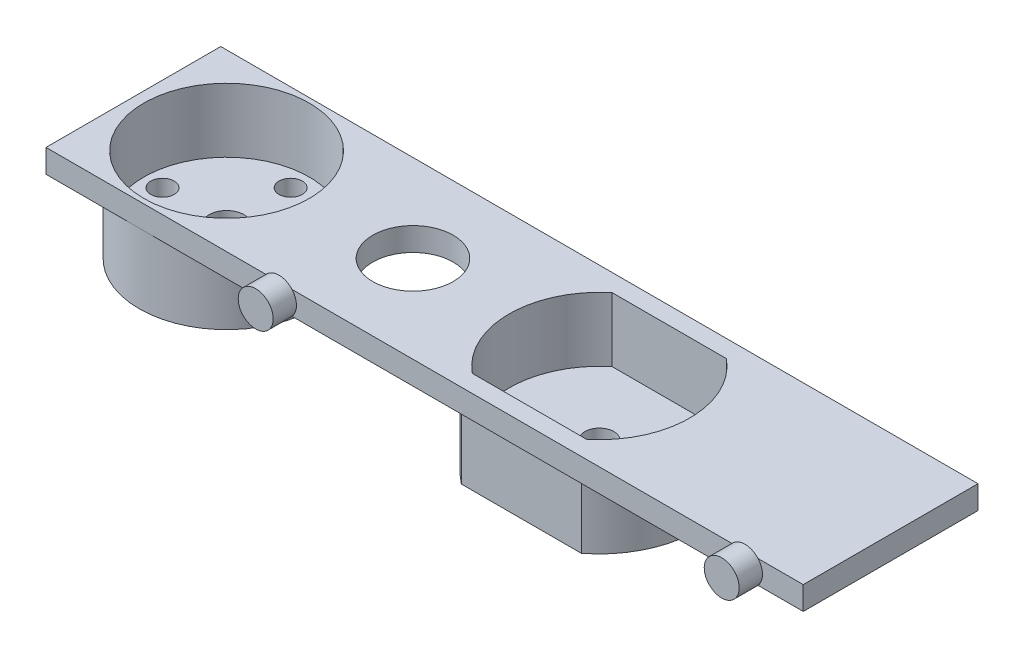
ISO-10303-21;
HEADER;
FILE_DESCRIPTION(('STEP AP214'),'2;1');
FILE_NAME('part.step','',(''),(''),'','','');
FILE_SCHEMA(('AUTOMOTIVE_DESIGN { 1 0 10303 214 1 1 1 1 }'));
ENDSEC;
DATA;
#1=APPLICATION_CONTEXT('core data for automotive mechanical design processes');
#2=APPLICATION_PROTOCOL_DEFINITION('international standard','automotive_design',2000,#1);
#3=PRODUCT_CONTEXT('',#1,'mechanical');
#4=PRODUCT('Part','Part','',(#3));
#5=PRODUCT_RELATED_PRODUCT_CATEGORY('part','',(#4));
#6=PRODUCT_DEFINITION_FORMATION('','',#4);
#7=PRODUCT_DEFINITION_CONTEXT('part definition',#1,'design');
#8=PRODUCT_DEFINITION('design','',#6,#7);
#9=PRODUCT_DEFINITION_SHAPE('','',#8);
#10=(LENGTH_UNIT() NAMED_UNIT(*) SI_UNIT(.MILLI.,.METRE.));
#11=(NAMED_UNIT(*) PLANE_ANGLE_UNIT() SI_UNIT($,.RADIAN.));
#12=(NAMED_UNIT(*) SI_UNIT($,.STERADIAN.) SOLID_ANGLE_UNIT());
#13=UNCERTAINTY_MEASURE_WITH_UNIT(LENGTH_MEASURE(1.E-05),#10,'distance_accuracy_value','');
#14=(GEOMETRIC_REPRESENTATION_CONTEXT(3) GLOBAL_UNCERTAINTY_ASSIGNED_CONTEXT((#13)) GLOBAL_UNIT_ASSIGNED_CONTEXT((#10,
#11,#12)) REPRESENTATION_CONTEXT('',''));
#15=CARTESIAN_POINT('',(0.,0.,0.));
#16=DIRECTION('',(0.,0.,1.));
#17=DIRECTION('',(1.,0.,0.));
#18=AXIS2_PLACEMENT_3D('',#15,#16,#17);
#19=CARTESIAN_POINT('',(0.,2.,0.));
#20=DIRECTION('',(0.,1.,0.));
#21=DIRECTION('',(0.,0.,1.));
#22=AXIS2_PLACEMENT_3D('',#19,#20,#21);
#23=PLANE('',#22);
#24=DIRECTION('',(0.,0.,-1.));
#25=VECTOR('',#24,1.);
#26=CARTESIAN_POINT('',(-40.,2.,0.));
#27=LINE('',#26,#25);
#28=CARTESIAN_POINT('',(-40.,2.,7.5));
#29=VERTEX_POINT('',#28);
#30=CARTESIAN_POINT('',(-40.,2.,-7.5));
#31=VERTEX_POINT('',#30);
#32=EDGE_CURVE('E415',#29,#31,#27,.T.);
#33=ORIENTED_EDGE('',*,*,#32,.F.);
#34=DIRECTION('',(-1.,0.,0.));
#35=VECTOR('',#34,1.);
#36=CARTESIAN_POINT('',(0.,2.,7.5));
#37=LINE('',#36,#35);
#38=CARTESIAN_POINT('',(-21.1180339887499,2.,7.5));
#39=VERTEX_POINT('',#38);
#40=EDGE_CURVE('E419',#39,#29,#37,.T.);
#41=ORIENTED_EDGE('',*,*,#40,.F.);
#42=CARTESIAN_POINT('',(-18.8819660112501,2.,7.5));
#43=VERTEX_POINT('',#42);
#44=EDGE_CURVE('E536',#43,#39,#37,.T.);
#45=ORIENTED_EDGE('',*,*,#44,.F.);
#46=CARTESIAN_POINT('',(18.8819660112501,2.,7.5));
#47=VERTEX_POINT('',#46);
#48=EDGE_CURVE('E533',#47,#43,#37,.T.);
#49=ORIENTED_EDGE('',*,*,#48,.F.);
#50=CARTESIAN_POINT('',(21.1180339887499,2.,7.5));
#51=VERTEX_POINT('',#50);
#52=EDGE_CURVE('E425',#51,#47,#37,.T.);
#53=ORIENTED_EDGE('',*,*,#52,.F.);
#54=CARTESIAN_POINT('',(25.,2.,7.5));
#55=VERTEX_POINT('',#54);
#56=EDGE_CURVE('E421',#55,#51,#37,.T.);
#57=ORIENTED_EDGE('',*,*,#56,.F.);
#58=DIRECTION('',(0.,0.,1.));
#59=VECTOR('',#58,1.);
#60=CARTESIAN_POINT('',(25.,2.,-7.5));
#61=LINE('',#60,#59);
#62=CARTESIAN_POINT('',(25.,2.,-7.5));
#63=VERTEX_POINT('',#62);
#64=EDGE_CURVE('E451',#63,#55,#61,.T.);
#65=ORIENTED_EDGE('',*,*,#64,.F.);
#66=DIRECTION('',(-1.,0.,0.));
#67=VECTOR('',#66,1.);
#68=CARTESIAN_POINT('',(0.,2.,-7.5));
#69=LINE('',#68,#67);
#70=EDGE_CURVE('E424',#63,#31,#69,.T.);
#71=ORIENTED_EDGE('',*,*,#70,.T.);
#72=EDGE_LOOP('',(#33,#41,#45,#49,#53,#57,#65,#71));
#73=FACE_BOUND('',#72,.T.);
#74=CARTESIAN_POINT('',(-16.,2.,0.));
#75=DIRECTION('',(0.,1.,0.));
#76=DIRECTION('',(0.,0.,1.));
#77=AXIS2_PLACEMENT_3D('',#74,#75,#76);
#78=CIRCLE('',#77,3.45);
#79=CARTESIAN_POINT('',(-16.,2.,3.45));
#80=VERTEX_POINT('',#79);
#81=EDGE_CURVE('E393',#80,#80,#78,.F.);
#82=ORIENTED_EDGE('',*,*,#81,.T.);
#83=EDGE_LOOP('',(#82));
#84=FACE_BOUND('',#83,.T.);
#85=CARTESIAN_POINT('',(-32.,2.,0.));
#86=DIRECTION('',(0.,1.,0.));
#87=DIRECTION('',(0.,0.,1.));
#88=AXIS2_PLACEMENT_3D('',#85,#86,#87);
#89=CIRCLE('',#88,7.1);
#90=CARTESIAN_POINT('',(-32.,2.,7.1));
#91=VERTEX_POINT('',#90);
#92=EDGE_CURVE('E253',#91,#91,#89,.T.);
#93=ORIENTED_EDGE('',*,*,#92,.F.);
#94=EDGE_LOOP('',(#93));
#95=FACE_BOUND('',#94,.T.);
#96=CARTESIAN_POINT('',(0.,2.,0.));
#97=DIRECTION('',(0.,1.,0.));
#98=DIRECTION('',(0.,0.,1.));
#99=AXIS2_PLACEMENT_3D('',#96,#97,#98);
#100=CIRCLE('',#99,7.75);
#101=CARTESIAN_POINT('',(4.90535421758714,2.,6.));
#102=VERTEX_POINT('',#101);
#103=CARTESIAN_POINT('',(4.90535421758714,2.,-6.));
#104=VERTEX_POINT('',#103);
#105=EDGE_CURVE('E280',#102,#104,#100,.T.);
#106=ORIENTED_EDGE('',*,*,#105,.F.);
#107=DIRECTION('',(-1.,0.,0.));
#108=VECTOR('',#107,1.);
#109=CARTESIAN_POINT('',(0.,2.,6.));
#110=LINE('',#109,#108);
#111=CARTESIAN_POINT('',(-4.90535421758714,2.,6.));
#112=VERTEX_POINT('',#111);
#113=EDGE_CURVE('E140',#102,#112,#110,.T.);
#114=ORIENTED_EDGE('',*,*,#113,.T.);
#115=CARTESIAN_POINT('',(0.,2.,0.));
#116=DIRECTION('',(0.,1.,0.));
#117=DIRECTION('',(0.,0.,1.));
#118=AXIS2_PLACEMENT_3D('',#115,#116,#117);
#119=CIRCLE('',#118,7.75);
#120=CARTESIAN_POINT('',(-4.90535421758714,2.,-6.));
#121=VERTEX_POINT('',#120);
#122=EDGE_CURVE('E266',#121,#112,#119,.T.);
#123=ORIENTED_EDGE('',*,*,#122,.F.);
#124=DIRECTION('',(-1.,0.,0.));
#125=VECTOR('',#124,1.);
#126=CARTESIAN_POINT('',(0.,2.,-6.));
#127=LINE('',#126,#125);
#128=EDGE_CURVE('E916',#104,#121,#127,.T.);
#129=ORIENTED_EDGE('',*,*,#128,.F.);
#130=EDGE_LOOP('',(#106,#114,#123,#129));
#131=FACE_BOUND('',#130,.T.);
#132=ADVANCED_FACE('F121',(#73,#84,#95,#131),#23,.T.);
#133=CARTESIAN_POINT('',(-32.,11.7580735803744,5.5));
#134=DIRECTION('',(0.,-1.,0.));
#135=DIRECTION('',(0.,0.,-1.));
#136=AXIS2_PLACEMENT_3D('',#133,#134,#135);
#137=CYLINDRICAL_SURFACE('',#136,0.999999999999998);
#138=CARTESIAN_POINT('',(-32.,-6.,5.5));
#139=DIRECTION('',(0.,1.,0.));
#140=DIRECTION('',(0.,0.,1.));
#141=AXIS2_PLACEMENT_3D('',#138,#139,#140);
#142=CIRCLE('',#141,0.999999999999998);
#143=CARTESIAN_POINT('',(-32.,-6.,6.5));
#144=VERTEX_POINT('',#143);
#145=EDGE_CURVE('E325',#144,#144,#142,.T.);
#146=ORIENTED_EDGE('',*,*,#145,.F.);
#147=EDGE_LOOP('',(#146));
#148=FACE_BOUND('',#147,.T.);
#149=CARTESIAN_POINT('',(-32.,-3.5,5.5));
#150=DIRECTION('',(0.,1.,0.));
#151=DIRECTION('',(0.,0.,1.));
#152=AXIS2_PLACEMENT_3D('',#149,#150,#151);
#153=CIRCLE('',#152,0.999999999999998);
#154=CARTESIAN_POINT('',(-32.,-3.5,6.5));
#155=VERTEX_POINT('',#154);
#156=EDGE_CURVE('E307',#155,#155,#153,.T.);
#157=ORIENTED_EDGE('',*,*,#156,.T.);
#158=EDGE_LOOP('',(#157));
#159=FACE_BOUND('',#158,.T.);
#160=ADVANCED_FACE('F561',(#148,#159),#137,.F.);
#161=CARTESIAN_POINT('',(-32.,11.7580735803744,0.));
#162=DIRECTION('',(0.,-1.,0.));
#163=DIRECTION('',(0.,0.,-1.));
#164=AXIS2_PLACEMENT_3D('',#161,#162,#163);
#165=CYLINDRICAL_SURFACE('',#164,1.5);
#166=CARTESIAN_POINT('',(-32.,-6.,0.));
#167=DIRECTION('',(0.,1.,0.));
#168=DIRECTION('',(0.,0.,1.));
#169=AXIS2_PLACEMENT_3D('',#166,#167,#168);
#170=CIRCLE('',#169,1.5);
#171=CARTESIAN_POINT('',(-32.,-6.,1.50000000000001));
#172=VERTEX_POINT('',#171);
#173=EDGE_CURVE('E329',#172,#172,#170,.T.);
#174=ORIENTED_EDGE('',*,*,#173,.F.);
#175=EDGE_LOOP('',(#174));
#176=FACE_BOUND('',#175,.T.);
#177=CARTESIAN_POINT('',(-32.,-3.5,0.));
#178=DIRECTION('',(0.,1.,0.));
#179=DIRECTION('',(0.,0.,1.));
#180=AXIS2_PLACEMENT_3D('',#177,#178,#179);
#181=CIRCLE('',#180,1.5);
#182=CARTESIAN_POINT('',(-32.,-3.5,1.50000000000001));
#183=VERTEX_POINT('',#182);
#184=EDGE_CURVE('E303',#183,#183,#181,.T.);
#185=ORIENTED_EDGE('',*,*,#184,.T.);
#186=EDGE_LOOP('',(#185));
#187=FACE_BOUND('',#186,.T.);
#188=ADVANCED_FACE('F567',(#176,#187),#165,.F.);
#189=CARTESIAN_POINT('',(-37.5,11.7580735803744,0.));
#190=DIRECTION('',(0.,-1.,0.));
#191=DIRECTION('',(0.,0.,-1.));
#192=AXIS2_PLACEMENT_3D('',#189,#190,#191);
#193=CYLINDRICAL_SURFACE('',#192,0.999999999999991);
#194=CARTESIAN_POINT('',(-37.5,-6.,0.));
#195=DIRECTION('',(0.,1.,0.));
#196=DIRECTION('',(0.,0.,1.));
#197=AXIS2_PLACEMENT_3D('',#194,#195,#196);
#198=CIRCLE('',#197,0.999999999999991);
#199=CARTESIAN_POINT('',(-37.5,-6.,0.999999999999992));
#200=VERTEX_POINT('',#199);
#201=EDGE_CURVE('E321',#200,#200,#198,.T.);
#202=ORIENTED_EDGE('',*,*,#201,.F.);
#203=EDGE_LOOP('',(#202));
#204=FACE_BOUND('',#203,.T.);
#205=CARTESIAN_POINT('',(-37.5,-3.5,0.));
#206=DIRECTION('',(0.,1.,0.));
#207=DIRECTION('',(0.,0.,1.));
#208=AXIS2_PLACEMENT_3D('',#205,#206,#207);
#209=CIRCLE('',#208,0.999999999999991);
#210=CARTESIAN_POINT('',(-37.5,-3.5,0.999999999999992));
#211=VERTEX_POINT('',#210);
#212=EDGE_CURVE('E299',#211,#211,#209,.T.);
#213=ORIENTED_EDGE('',*,*,#212,.T.);
#214=EDGE_LOOP('',(#213));
#215=FACE_BOUND('',#214,.T.);
#216=ADVANCED_FACE('F572',(#204,#215),#193,.F.);
#217=CARTESIAN_POINT('',(-26.5,11.7580735803744,0.));
#218=DIRECTION('',(0.,-1.,0.));
#219=DIRECTION('',(0.,0.,-1.));
#220=AXIS2_PLACEMENT_3D('',#217,#218,#219);
#221=CYLINDRICAL_SURFACE('',#220,0.999999999999998);
#222=CARTESIAN_POINT('',(-26.5,-6.,0.));
#223=DIRECTION('',(0.,1.,0.));
#224=DIRECTION('',(0.,0.,1.));
#225=AXIS2_PLACEMENT_3D('',#222,#223,#224);
#226=CIRCLE('',#225,0.999999999999998);
#227=CARTESIAN_POINT('',(-26.5,-6.,0.999999999999999));
#228=VERTEX_POINT('',#227);
#229=EDGE_CURVE('E317',#228,#228,#226,.T.);
#230=ORIENTED_EDGE('',*,*,#229,.F.);
#231=EDGE_LOOP('',(#230));
#232=FACE_BOUND('',#231,.T.);
#233=CARTESIAN_POINT('',(-26.5,-3.5,0.));
#234=DIRECTION('',(0.,1.,0.));
#235=DIRECTION('',(0.,0.,1.));
#236=AXIS2_PLACEMENT_3D('',#233,#234,#235);
#237=CIRCLE('',#236,0.999999999999998);
#238=CARTESIAN_POINT('',(-26.5,-3.5,0.999999999999999));
#239=VERTEX_POINT('',#238);
#240=EDGE_CURVE('E295',#239,#239,#237,.T.);
#241=ORIENTED_EDGE('',*,*,#240,.T.);
#242=EDGE_LOOP('',(#241));
#243=FACE_BOUND('',#242,.T.);
#244=ADVANCED_FACE('F787',(#232,#243),#221,.F.);
#245=CARTESIAN_POINT('',(-32.,11.7580735803744,-5.5));
#246=DIRECTION('',(0.,-1.,0.));
#247=DIRECTION('',(0.,0.,-1.));
#248=AXIS2_PLACEMENT_3D('',#245,#246,#247);
#249=CYLINDRICAL_SURFACE('',#248,0.999999999999991);
#250=CARTESIAN_POINT('',(-32.,-6.,-5.5));
#251=DIRECTION('',(0.,1.,0.));
#252=DIRECTION('',(0.,0.,1.));
#253=AXIS2_PLACEMENT_3D('',#250,#251,#252);
#254=CIRCLE('',#253,0.999999999999991);
#255=CARTESIAN_POINT('',(-32.,-6.,-4.50000000000001));
#256=VERTEX_POINT('',#255);
#257=EDGE_CURVE('E311',#256,#256,#254,.T.);
#258=ORIENTED_EDGE('',*,*,#257,.F.);
#259=EDGE_LOOP('',(#258));
#260=FACE_BOUND('',#259,.T.);
#261=CARTESIAN_POINT('',(-32.,-3.5,-5.5));
#262=DIRECTION('',(0.,1.,0.));
#263=DIRECTION('',(0.,0.,1.));
#264=AXIS2_PLACEMENT_3D('',#261,#262,#263);
#265=CIRCLE('',#264,0.999999999999991);
#266=CARTESIAN_POINT('',(-32.,-3.5,-4.50000000000001));
#267=VERTEX_POINT('',#266);
#268=EDGE_CURVE('E125',#267,#267,#265,.T.);
#269=ORIENTED_EDGE('',*,*,#268,.T.);
#270=EDGE_LOOP('',(#269));
#271=FACE_BOUND('',#270,.T.);
#272=ADVANCED_FACE('F774',(#260,#271),#249,.F.);
#273=CARTESIAN_POINT('',(0.,11.7580735803744,0.));
#274=DIRECTION('',(0.,-1.,0.));
#275=DIRECTION('',(0.,0.,-1.));
#276=AXIS2_PLACEMENT_3D('',#273,#274,#275);
#277=CYLINDRICAL_SURFACE('',#276,1.25);
#278=CARTESIAN_POINT('',(0.,-6.,0.));
#279=DIRECTION('',(0.,1.,0.));
#280=DIRECTION('',(0.,0.,1.));
#281=AXIS2_PLACEMENT_3D('',#278,#279,#280);
#282=CIRCLE('',#281,1.25);
#283=CARTESIAN_POINT('',(0.,-6.,1.25));
#284=VERTEX_POINT('',#283);
#285=EDGE_CURVE('E312',#284,#284,#282,.T.);
#286=ORIENTED_EDGE('',*,*,#285,.F.);
#287=EDGE_LOOP('',(#286));
#288=FACE_BOUND('',#287,.T.);
#289=CARTESIAN_POINT('',(0.,-3.5,0.));
#290=DIRECTION('',(0.,1.,0.));
#291=DIRECTION('',(0.,0.,1.));
#292=AXIS2_PLACEMENT_3D('',#289,#290,#291);
#293=CIRCLE('',#292,1.25);
#294=CARTESIAN_POINT('',(0.,-3.5,1.25));
#295=VERTEX_POINT('',#294);
#296=EDGE_CURVE('E262',#295,#295,#293,.T.);
#297=ORIENTED_EDGE('',*,*,#296,.T.);
#298=EDGE_LOOP('',(#297));
#299=FACE_BOUND('',#298,.T.);
#300=ADVANCED_FACE('F637',(#288,#299),#277,.F.);
#301=CARTESIAN_POINT('',(0.,0.,0.));
#302=DIRECTION('',(0.,1.,0.));
#303=DIRECTION('',(0.,0.,1.));
#304=AXIS2_PLACEMENT_3D('',#301,#302,#303);
#305=PLANE('',#304);
#306=CARTESIAN_POINT('',(-16.,0.,0.));
#307=DIRECTION('',(0.,-1.,0.));
#308=DIRECTION('',(0.,0.,-1.));
#309=AXIS2_PLACEMENT_3D('',#306,#307,#308);
#310=CIRCLE('',#309,3.45);
#311=CARTESIAN_POINT('',(-16.,0.,-3.45));
#312=VERTEX_POINT('',#311);
#313=EDGE_CURVE('E410',#312,#312,#310,.T.);
#314=ORIENTED_EDGE('',*,*,#313,.F.);
#315=EDGE_LOOP('',(#314));
#316=FACE_BOUND('',#315,.T.);
#317=DIRECTION('',(1.,0.,0.));
#318=VECTOR('',#317,1.);
#319=CARTESIAN_POINT('',(0.,0.,6.7));
#320=LINE('',#319,#318);
#321=CARTESIAN_POINT('',(-5.14902903468217,0.,6.7));
#322=VERTEX_POINT('',#321);
#323=CARTESIAN_POINT('',(5.14902903468217,0.,6.7));
#324=VERTEX_POINT('',#323);
#325=EDGE_CURVE('E381',#322,#324,#320,.T.);
#326=ORIENTED_EDGE('',*,*,#325,.T.);
#327=CARTESIAN_POINT('',(0.,0.,0.));
#328=DIRECTION('',(0.,1.,0.));
#329=DIRECTION('',(0.,0.,1.));
#330=AXIS2_PLACEMENT_3D('',#327,#328,#329);
#331=CIRCLE('',#330,8.45);
#332=CARTESIAN_POINT('',(5.14902903468217,0.,-6.7));
#333=VERTEX_POINT('',#332);
#334=EDGE_CURVE('E385',#324,#333,#331,.T.);
#335=ORIENTED_EDGE('',*,*,#334,.T.);
#336=DIRECTION('',(-1.,0.,0.));
#337=VECTOR('',#336,1.);
#338=CARTESIAN_POINT('',(0.,0.,-6.7));
#339=LINE('',#338,#337);
#340=CARTESIAN_POINT('',(-5.14902903468217,0.,-6.7));
#341=VERTEX_POINT('',#340);
#342=EDGE_CURVE('E373',#333,#341,#339,.T.);
#343=ORIENTED_EDGE('',*,*,#342,.T.);
#344=CARTESIAN_POINT('',(0.,0.,0.));
#345=DIRECTION('',(0.,1.,0.));
#346=DIRECTION('',(0.,0.,1.));
#347=AXIS2_PLACEMENT_3D('',#344,#345,#346);
#348=CIRCLE('',#347,8.45);
#349=EDGE_CURVE('E377',#341,#322,#348,.T.);
#350=ORIENTED_EDGE('',*,*,#349,.T.);
#351=EDGE_LOOP('',(#326,#335,#343,#350));
#352=FACE_BOUND('',#351,.T.);
#353=DIRECTION('',(-1.,0.,0.));
#354=VECTOR('',#353,1.);
#355=CARTESIAN_POINT('',(0.,0.,7.5));
#356=LINE('',#355,#354);
#357=CARTESIAN_POINT('',(-21.1180339887499,0.,7.5));
#358=VERTEX_POINT('',#357);
#359=CARTESIAN_POINT('',(-32.,0.,7.5));
#360=VERTEX_POINT('',#359);
#361=EDGE_CURVE('E510',#358,#360,#356,.T.);
#362=ORIENTED_EDGE('',*,*,#361,.T.);
#363=CARTESIAN_POINT('',(-32.,0.,0.));
#364=DIRECTION('',(0.,1.,0.));
#365=DIRECTION('',(0.,0.,1.));
#366=AXIS2_PLACEMENT_3D('',#363,#364,#365);
#367=CIRCLE('',#366,7.5);
#368=CARTESIAN_POINT('',(-32.,0.,-7.5));
#369=VERTEX_POINT('',#368);
#370=EDGE_CURVE('E372',#360,#369,#367,.T.);
#371=ORIENTED_EDGE('',*,*,#370,.T.);
#372=DIRECTION('',(-1.,0.,0.));
#373=VECTOR('',#372,1.);
#374=CARTESIAN_POINT('',(0.,0.,-7.5));
#375=LINE('',#374,#373);
#376=CARTESIAN_POINT('',(25.,0.,-7.5));
#377=VERTEX_POINT('',#376);
#378=EDGE_CURVE('E420',#377,#369,#375,.T.);
#379=ORIENTED_EDGE('',*,*,#378,.F.);
#380=DIRECTION('',(0.,0.,1.));
#381=VECTOR('',#380,1.);
#382=CARTESIAN_POINT('',(25.,0.,-7.5));
#383=LINE('',#382,#381);
#384=CARTESIAN_POINT('',(25.,0.,7.5));
#385=VERTEX_POINT('',#384);
#386=EDGE_CURVE('E414',#377,#385,#383,.T.);
#387=ORIENTED_EDGE('',*,*,#386,.T.);
#388=CARTESIAN_POINT('',(21.1180339887499,0.,7.5));
#389=VERTEX_POINT('',#388);
#390=EDGE_CURVE('E435',#385,#389,#356,.T.);
#391=ORIENTED_EDGE('',*,*,#390,.T.);
#392=CARTESIAN_POINT('',(18.8819660112501,0.,7.5));
#393=VERTEX_POINT('',#392);
#394=EDGE_CURVE('E440',#389,#393,#356,.T.);
#395=ORIENTED_EDGE('',*,*,#394,.T.);
#396=CARTESIAN_POINT('',(-18.8819660112501,0.,7.5));
#397=VERTEX_POINT('',#396);
#398=EDGE_CURVE('E509',#393,#397,#356,.T.);
#399=ORIENTED_EDGE('',*,*,#398,.T.);
#400=EDGE_CURVE('E506',#397,#358,#356,.T.);
#401=ORIENTED_EDGE('',*,*,#400,.T.);
#402=EDGE_LOOP('',(#362,#371,#379,#387,#391,#395,#399,#401));
#403=FACE_BOUND('',#402,.T.);
#404=ADVANCED_FACE('F471',(#316,#352,#403),#305,.F.);
#405=CARTESIAN_POINT('',(0.,2.,7.5));
#406=DIRECTION('',(0.,0.,1.));
#407=DIRECTION('',(1.,0.,0.));
#408=AXIS2_PLACEMENT_3D('',#405,#406,#407);
#409=PLANE('',#408);
#410=CARTESIAN_POINT('',(20.,0.999999999999999,7.5));
#411=DIRECTION('',(0.,0.,1.));
#412=DIRECTION('',(1.,0.,0.));
#413=AXIS2_PLACEMENT_3D('',#410,#411,#412);
#414=CIRCLE('',#413,1.5);
#415=EDGE_CURVE('E13',#47,#393,#414,.T.);
#416=ORIENTED_EDGE('',*,*,#415,.F.);
#417=ORIENTED_EDGE('',*,*,#48,.T.);
#418=CARTESIAN_POINT('',(-20.,0.999999999999995,7.5));
#419=DIRECTION('',(0.,0.,1.));
#420=DIRECTION('',(1.,0.,0.));
#421=AXIS2_PLACEMENT_3D('',#418,#419,#420);
#422=CIRCLE('',#421,1.5);
#423=EDGE_CURVE('E403',#397,#43,#422,.T.);
#424=ORIENTED_EDGE('',*,*,#423,.F.);
#425=ORIENTED_EDGE('',*,*,#398,.F.);
#426=EDGE_LOOP('',(#416,#417,#424,#425));
#427=FACE_BOUND('',#426,.T.);
#428=ADVANCED_FACE('F532',(#427),#409,.T.);
#429=ORIENTED_EDGE('',*,*,#40,.T.);
#430=DIRECTION('',(0.,-1.,0.));
#431=VECTOR('',#430,1.);
#432=CARTESIAN_POINT('',(-40.,2.,7.5));
#433=LINE('',#432,#431);
#434=CARTESIAN_POINT('',(-40.,0.,7.5));
#435=VERTEX_POINT('',#434);
#436=EDGE_CURVE('E447',#29,#435,#433,.T.);
#437=ORIENTED_EDGE('',*,*,#436,.T.);
#438=EDGE_CURVE('E433',#360,#435,#356,.T.);
#439=ORIENTED_EDGE('',*,*,#438,.F.);
#440=ORIENTED_EDGE('',*,*,#361,.F.);
#441=EDGE_CURVE('E491',#39,#358,#422,.T.);
#442=ORIENTED_EDGE('',*,*,#441,.F.);
#443=EDGE_LOOP('',(#429,#437,#439,#440,#442));
#444=FACE_BOUND('',#443,.T.);
#445=ADVANCED_FACE('F520',(#444),#409,.T.);
#446=CARTESIAN_POINT('',(-40.,0.,-7.5));
#447=VERTEX_POINT('',#446);
#448=EDGE_CURVE('E439',#369,#447,#375,.T.);
#449=ORIENTED_EDGE('',*,*,#448,.F.);
#450=EDGE_CURVE('E340',#369,#360,#367,.T.);
#451=ORIENTED_EDGE('',*,*,#450,.T.);
#452=ORIENTED_EDGE('',*,*,#438,.T.);
#453=DIRECTION('',(0.,0.,-1.));
#454=VECTOR('',#453,1.);
#455=CARTESIAN_POINT('',(-40.,0.,0.));
#456=LINE('',#455,#454);
#457=EDGE_CURVE('E429',#435,#447,#456,.T.);
#458=ORIENTED_EDGE('',*,*,#457,.T.);
#459=EDGE_LOOP('',(#449,#451,#452,#458));
#460=FACE_BOUND('',#459,.T.);
#461=ADVANCED_FACE('F516',(#460),#305,.F.);
#462=CARTESIAN_POINT('',(0.,2.,-7.5));
#463=DIRECTION('',(0.,0.,1.));
#464=DIRECTION('',(1.,0.,0.));
#465=AXIS2_PLACEMENT_3D('',#462,#463,#464);
#466=PLANE('',#465);
#467=ORIENTED_EDGE('',*,*,#378,.T.);
#468=ORIENTED_EDGE('',*,*,#448,.T.);
#469=DIRECTION('',(0.,-1.,0.));
#470=VECTOR('',#469,1.);
#471=CARTESIAN_POINT('',(-40.,2.,-7.5));
#472=LINE('',#471,#470);
#473=EDGE_CURVE('E428',#31,#447,#472,.T.);
#474=ORIENTED_EDGE('',*,*,#473,.F.);
#475=ORIENTED_EDGE('',*,*,#70,.F.);
#476=DIRECTION('',(0.,-1.,0.));
#477=VECTOR('',#476,1.);
#478=CARTESIAN_POINT('',(25.,2.,-7.5));
#479=LINE('',#478,#477);
#480=EDGE_CURVE('E455',#63,#377,#479,.T.);
#481=ORIENTED_EDGE('',*,*,#480,.T.);
#482=EDGE_LOOP('',(#467,#468,#474,#475,#481));
#483=FACE_BOUND('',#482,.T.);
#484=ADVANCED_FACE('F477',(#483),#466,.F.);
#485=EDGE_CURVE('E131',#389,#51,#414,.T.);
#486=ORIENTED_EDGE('',*,*,#485,.F.);
#487=ORIENTED_EDGE('',*,*,#390,.F.);
#488=DIRECTION('',(0.,-1.,0.));
#489=VECTOR('',#488,1.);
#490=CARTESIAN_POINT('',(25.,2.,7.5));
#491=LINE('',#490,#489);
#492=EDGE_CURVE('E434',#55,#385,#491,.T.);
#493=ORIENTED_EDGE('',*,*,#492,.F.);
#494=ORIENTED_EDGE('',*,*,#56,.T.);
#495=EDGE_LOOP('',(#486,#487,#493,#494));
#496=FACE_BOUND('',#495,.T.);
#497=ADVANCED_FACE('F486',(#496),#409,.T.);
#498=CARTESIAN_POINT('',(-40.,2.,0.));
#499=DIRECTION('',(-1.,0.,0.));
#500=DIRECTION('',(0.,0.,1.));
#501=AXIS2_PLACEMENT_3D('',#498,#499,#500);
#502=PLANE('',#501);
#503=ORIENTED_EDGE('',*,*,#457,.F.);
#504=ORIENTED_EDGE('',*,*,#436,.F.);
#505=ORIENTED_EDGE('',*,*,#32,.T.);
#506=ORIENTED_EDGE('',*,*,#473,.T.);
#507=EDGE_LOOP('',(#503,#504,#505,#506));
#508=FACE_BOUND('',#507,.T.);
#509=ADVANCED_FACE('F523',(#508),#502,.T.);
#510=CARTESIAN_POINT('',(25.,2.,-7.5));
#511=DIRECTION('',(1.,0.,0.));
#512=DIRECTION('',(0.,0.,-1.));
#513=AXIS2_PLACEMENT_3D('',#510,#511,#512);
#514=PLANE('',#513);
#515=ORIENTED_EDGE('',*,*,#386,.F.);
#516=ORIENTED_EDGE('',*,*,#480,.F.);
#517=ORIENTED_EDGE('',*,*,#64,.T.);
#518=ORIENTED_EDGE('',*,*,#492,.T.);
#519=EDGE_LOOP('',(#515,#516,#517,#518));
#520=FACE_BOUND('',#519,.T.);
#521=ADVANCED_FACE('F123',(#520),#514,.T.);
#522=CARTESIAN_POINT('',(-16.,11.7580735803744,0.));
#523=DIRECTION('',(0.,-1.,0.));
#524=DIRECTION('',(0.,0.,-1.));
#525=AXIS2_PLACEMENT_3D('',#522,#523,#524);
#526=CYLINDRICAL_SURFACE('',#525,3.45);
#527=ORIENTED_EDGE('',*,*,#313,.T.);
#528=EDGE_LOOP('',(#527));
#529=FACE_BOUND('',#528,.T.);
#530=ORIENTED_EDGE('',*,*,#81,.F.);
#531=EDGE_LOOP('',(#530));
#532=FACE_BOUND('',#531,.T.);
#533=ADVANCED_FACE('F546',(#529,#532),#526,.F.);
#534=CARTESIAN_POINT('',(-20.,0.999999999999995,7.5));
#535=DIRECTION('',(0.,0.,1.));
#536=DIRECTION('',(1.,0.,0.));
#537=AXIS2_PLACEMENT_3D('',#534,#535,#536);
#538=PLANE('',#537);
#539=EDGE_CURVE('E398',#43,#39,#422,.T.);
#540=ORIENTED_EDGE('',*,*,#539,.F.);
#541=ORIENTED_EDGE('',*,*,#44,.T.);
#542=EDGE_LOOP('',(#540,#541));
#543=FACE_BOUND('',#542,.T.);
#544=ADVANCED_FACE('F544',(#543),#538,.F.);
#545=CARTESIAN_POINT('',(-20.,0.999999999999995,9.5));
#546=DIRECTION('',(0.,0.,-1.));
#547=DIRECTION('',(-1.,0.,0.));
#548=AXIS2_PLACEMENT_3D('',#545,#546,#547);
#549=CYLINDRICAL_SURFACE('',#548,1.5);
#550=CARTESIAN_POINT('',(-20.,0.999999999999995,9.5));
#551=DIRECTION('',(0.,0.,1.));
#552=DIRECTION('',(1.,0.,0.));
#553=AXIS2_PLACEMENT_3D('',#550,#551,#552);
#554=CIRCLE('',#553,1.5);
#555=CARTESIAN_POINT('',(-18.5,0.999999999999995,9.5));
#556=VERTEX_POINT('',#555);
#557=EDGE_CURVE('E389',#556,#556,#554,.T.);
#558=ORIENTED_EDGE('',*,*,#557,.F.);
#559=EDGE_LOOP('',(#558));
#560=FACE_BOUND('',#559,.T.);
#561=ORIENTED_EDGE('',*,*,#539,.T.);
#562=ORIENTED_EDGE('',*,*,#441,.T.);
#563=EDGE_CURVE('E402',#358,#397,#422,.T.);
#564=ORIENTED_EDGE('',*,*,#563,.T.);
#565=ORIENTED_EDGE('',*,*,#423,.T.);
#566=EDGE_LOOP('',(#561,#562,#564,#565));
#567=FACE_BOUND('',#566,.T.);
#568=ADVANCED_FACE('F500',(#560,#567),#549,.T.);
#569=CARTESIAN_POINT('',(-20.,0.999999999999995,9.5));
#570=DIRECTION('',(0.,0.,1.));
#571=DIRECTION('',(1.,0.,0.));
#572=AXIS2_PLACEMENT_3D('',#569,#570,#571);
#573=PLANE('',#572);
#574=ORIENTED_EDGE('',*,*,#557,.T.);
#575=EDGE_LOOP('',(#574));
#576=FACE_BOUND('',#575,.T.);
#577=ADVANCED_FACE('F552',(#576),#573,.T.);
#578=ORIENTED_EDGE('',*,*,#400,.F.);
#579=ORIENTED_EDGE('',*,*,#563,.F.);
#580=EDGE_LOOP('',(#578,#579));
#581=FACE_BOUND('',#580,.T.);
#582=ADVANCED_FACE('F504',(#581),#538,.F.);
#583=CARTESIAN_POINT('',(20.,0.999999999999999,7.5));
#584=DIRECTION('',(0.,0.,1.));
#585=DIRECTION('',(1.,0.,0.));
#586=AXIS2_PLACEMENT_3D('',#583,#584,#585);
#587=PLANE('',#586);
#588=EDGE_CURVE('E394',#51,#47,#414,.T.);
#589=ORIENTED_EDGE('',*,*,#588,.F.);
#590=ORIENTED_EDGE('',*,*,#52,.T.);
#591=EDGE_LOOP('',(#589,#590));
#592=FACE_BOUND('',#591,.T.);
#593=ADVANCED_FACE('F539',(#592),#587,.F.);
#594=CARTESIAN_POINT('',(20.,0.999999999999999,9.5));
#595=DIRECTION('',(0.,0.,-1.));
#596=DIRECTION('',(-1.,0.,0.));
#597=AXIS2_PLACEMENT_3D('',#594,#595,#596);
#598=CYLINDRICAL_SURFACE('',#597,1.5);
#599=CARTESIAN_POINT('',(20.,0.999999999999999,9.5));
#600=DIRECTION('',(0.,0.,1.));
#601=DIRECTION('',(1.,0.,0.));
#602=AXIS2_PLACEMENT_3D('',#599,#600,#601);
#603=CIRCLE('',#602,1.5);
#604=CARTESIAN_POINT('',(21.5,0.999999999999999,9.5));
#605=VERTEX_POINT('',#604);
#606=EDGE_CURVE('E390',#605,#605,#603,.T.);
#607=ORIENTED_EDGE('',*,*,#606,.F.);
#608=EDGE_LOOP('',(#607));
#609=FACE_BOUND('',#608,.T.);
#610=ORIENTED_EDGE('',*,*,#588,.T.);
#611=ORIENTED_EDGE('',*,*,#415,.T.);
#612=EDGE_CURVE('E133',#393,#389,#414,.T.);
#613=ORIENTED_EDGE('',*,*,#612,.T.);
#614=ORIENTED_EDGE('',*,*,#485,.T.);
#615=EDGE_LOOP('',(#610,#611,#613,#614));
#616=FACE_BOUND('',#615,.T.);
#617=ADVANCED_FACE('F530',(#609,#616),#598,.T.);
#618=CARTESIAN_POINT('',(20.,0.999999999999999,9.5));
#619=DIRECTION('',(0.,0.,1.));
#620=DIRECTION('',(1.,0.,0.));
#621=AXIS2_PLACEMENT_3D('',#618,#619,#620);
#622=PLANE('',#621);
#623=ORIENTED_EDGE('',*,*,#606,.T.);
#624=EDGE_LOOP('',(#623));
#625=FACE_BOUND('',#624,.T.);
#626=ADVANCED_FACE('F647',(#625),#622,.T.);
#627=ORIENTED_EDGE('',*,*,#394,.F.);
#628=ORIENTED_EDGE('',*,*,#612,.F.);
#629=EDGE_LOOP('',(#627,#628));
#630=FACE_BOUND('',#629,.T.);
#631=ADVANCED_FACE('F528',(#630),#587,.F.);
#632=CARTESIAN_POINT('',(0.,-6.,0.));
#633=DIRECTION('',(0.,1.,0.));
#634=DIRECTION('',(0.,0.,1.));
#635=AXIS2_PLACEMENT_3D('',#632,#633,#634);
#636=CYLINDRICAL_SURFACE('',#635,8.45);
#637=ORIENTED_EDGE('',*,*,#334,.F.);
#638=DIRECTION('',(0.,1.,0.));
#639=VECTOR('',#638,1.);
#640=CARTESIAN_POINT('',(5.14902903468217,-6.,6.7));
#641=LINE('',#640,#639);
#642=CARTESIAN_POINT('',(5.14902903468217,-6.,6.7));
#643=VERTEX_POINT('',#642);
#644=EDGE_CURVE('E316',#643,#324,#641,.T.);
#645=ORIENTED_EDGE('',*,*,#644,.F.);
#646=CARTESIAN_POINT('',(0.,-6.,0.));
#647=DIRECTION('',(0.,1.,0.));
#648=DIRECTION('',(0.,0.,1.));
#649=AXIS2_PLACEMENT_3D('',#646,#647,#648);
#650=CIRCLE('',#649,8.45);
#651=CARTESIAN_POINT('',(5.14902903468217,-6.,-6.7));
#652=VERTEX_POINT('',#651);
#653=EDGE_CURVE('E341',#643,#652,#650,.T.);
#654=ORIENTED_EDGE('',*,*,#653,.T.);
#655=DIRECTION('',(0.,1.,0.));
#656=VECTOR('',#655,1.);
#657=CARTESIAN_POINT('',(5.14902903468217,-6.,-6.7));
#658=LINE('',#657,#656);
#659=EDGE_CURVE('E342',#652,#333,#658,.T.);
#660=ORIENTED_EDGE('',*,*,#659,.T.);
#661=EDGE_LOOP('',(#637,#645,#654,#660));
#662=FACE_BOUND('',#661,.T.);
#663=ADVANCED_FACE('F646',(#662),#636,.T.);
#664=CARTESIAN_POINT('',(5.14902903468217,-6.,6.7));
#665=DIRECTION('',(0.,0.,1.));
#666=DIRECTION('',(1.,0.,0.));
#667=AXIS2_PLACEMENT_3D('',#664,#665,#666);
#668=PLANE('',#667);
#669=ORIENTED_EDGE('',*,*,#325,.F.);
#670=DIRECTION('',(0.,1.,0.));
#671=VECTOR('',#670,1.);
#672=CARTESIAN_POINT('',(-5.14902903468217,-6.,6.7));
#673=LINE('',#672,#671);
#674=CARTESIAN_POINT('',(-5.14902903468217,-6.,6.7));
#675=VERTEX_POINT('',#674);
#676=EDGE_CURVE('E349',#675,#322,#673,.T.);
#677=ORIENTED_EDGE('',*,*,#676,.F.);
#678=DIRECTION('',(1.,0.,0.));
#679=VECTOR('',#678,1.);
#680=CARTESIAN_POINT('',(5.14902903468217,-6.,6.7));
#681=LINE('',#680,#679);
#682=EDGE_CURVE('E346',#675,#643,#681,.T.);
#683=ORIENTED_EDGE('',*,*,#682,.T.);
#684=ORIENTED_EDGE('',*,*,#644,.T.);
#685=EDGE_LOOP('',(#669,#677,#683,#684));
#686=FACE_BOUND('',#685,.T.);
#687=ADVANCED_FACE('F712',(#686),#668,.T.);
#688=CARTESIAN_POINT('',(0.,-6.,0.));
#689=DIRECTION('',(0.,1.,0.));
#690=DIRECTION('',(0.,0.,1.));
#691=AXIS2_PLACEMENT_3D('',#688,#689,#690);
#692=CYLINDRICAL_SURFACE('',#691,8.45);
#693=ORIENTED_EDGE('',*,*,#349,.F.);
#694=DIRECTION('',(0.,1.,0.));
#695=VECTOR('',#694,1.);
#696=CARTESIAN_POINT('',(-5.14902903468217,-6.,-6.7));
#697=LINE('',#696,#695);
#698=CARTESIAN_POINT('',(-5.14902903468217,-6.,-6.7));
#699=VERTEX_POINT('',#698);
#700=EDGE_CURVE('E148',#699,#341,#697,.T.);
#701=ORIENTED_EDGE('',*,*,#700,.F.);
#702=CARTESIAN_POINT('',(0.,-6.,0.));
#703=DIRECTION('',(0.,1.,0.));
#704=DIRECTION('',(0.,0.,1.));
#705=AXIS2_PLACEMENT_3D('',#702,#703,#704);
#706=CIRCLE('',#705,8.45);
#707=EDGE_CURVE('E359',#699,#675,#706,.T.);
#708=ORIENTED_EDGE('',*,*,#707,.T.);
#709=ORIENTED_EDGE('',*,*,#676,.T.);
#710=EDGE_LOOP('',(#693,#701,#708,#709));
#711=FACE_BOUND('',#710,.T.);
#712=ADVANCED_FACE('F721',(#711),#692,.T.);
#713=CARTESIAN_POINT('',(5.14902903468217,-6.,-6.7));
#714=DIRECTION('',(0.,0.,-1.));
#715=DIRECTION('',(-1.,0.,0.));
#716=AXIS2_PLACEMENT_3D('',#713,#714,#715);
#717=PLANE('',#716);
#718=ORIENTED_EDGE('',*,*,#342,.F.);
#719=ORIENTED_EDGE('',*,*,#659,.F.);
#720=DIRECTION('',(-1.,0.,0.));
#721=VECTOR('',#720,1.);
#722=CARTESIAN_POINT('',(5.14902903468217,-6.,-6.7));
#723=LINE('',#722,#721);
#724=EDGE_CURVE('E363',#652,#699,#723,.T.);
#725=ORIENTED_EDGE('',*,*,#724,.T.);
#726=ORIENTED_EDGE('',*,*,#700,.T.);
#727=EDGE_LOOP('',(#718,#719,#725,#726));
#728=FACE_BOUND('',#727,.T.);
#729=ADVANCED_FACE('F730',(#728),#717,.T.);
#730=CARTESIAN_POINT('',(0.,-6.,0.));
#731=DIRECTION('',(0.,1.,0.));
#732=DIRECTION('',(0.,0.,1.));
#733=AXIS2_PLACEMENT_3D('',#730,#731,#732);
#734=PLANE('',#733);
#735=ORIENTED_EDGE('',*,*,#653,.F.);
#736=ORIENTED_EDGE('',*,*,#682,.F.);
#737=ORIENTED_EDGE('',*,*,#707,.F.);
#738=ORIENTED_EDGE('',*,*,#724,.F.);
#739=EDGE_LOOP('',(#735,#736,#737,#738));
#740=FACE_BOUND('',#739,.T.);
#741=ORIENTED_EDGE('',*,*,#285,.T.);
#742=EDGE_LOOP('',(#741));
#743=FACE_BOUND('',#742,.T.);
#744=ADVANCED_FACE('F739',(#740,#743),#734,.F.);
#745=CARTESIAN_POINT('',(-32.,-6.,0.));
#746=DIRECTION('',(0.,1.,0.));
#747=DIRECTION('',(0.,0.,1.));
#748=AXIS2_PLACEMENT_3D('',#745,#746,#747);
#749=CYLINDRICAL_SURFACE('',#748,7.5);
#750=CARTESIAN_POINT('',(-32.,-6.,0.));
#751=DIRECTION('',(0.,1.,0.));
#752=DIRECTION('',(0.,0.,1.));
#753=AXIS2_PLACEMENT_3D('',#750,#751,#752);
#754=CIRCLE('',#753,7.5);
#755=CARTESIAN_POINT('',(-32.,-6.,7.5));
#756=VERTEX_POINT('',#755);
#757=EDGE_CURVE('E336',#756,#756,#754,.T.);
#758=ORIENTED_EDGE('',*,*,#757,.T.);
#759=EDGE_LOOP('',(#758));
#760=FACE_BOUND('',#759,.T.);
#761=ORIENTED_EDGE('',*,*,#370,.F.);
#762=ORIENTED_EDGE('',*,*,#450,.F.);
#763=EDGE_LOOP('',(#761,#762));
#764=FACE_BOUND('',#763,.T.);
#765=ADVANCED_FACE('F747',(#760,#764),#749,.T.);
#766=CARTESIAN_POINT('',(-32.,-6.,0.));
#767=DIRECTION('',(0.,1.,0.));
#768=DIRECTION('',(0.,0.,1.));
#769=AXIS2_PLACEMENT_3D('',#766,#767,#768);
#770=PLANE('',#769);
#771=ORIENTED_EDGE('',*,*,#757,.F.);
#772=EDGE_LOOP('',(#771));
#773=FACE_BOUND('',#772,.T.);
#774=ORIENTED_EDGE('',*,*,#257,.T.);
#775=EDGE_LOOP('',(#774));
#776=FACE_BOUND('',#775,.T.);
#777=ORIENTED_EDGE('',*,*,#201,.T.);
#778=EDGE_LOOP('',(#777));
#779=FACE_BOUND('',#778,.T.);
#780=ORIENTED_EDGE('',*,*,#145,.T.);
#781=EDGE_LOOP('',(#780));
#782=FACE_BOUND('',#781,.T.);
#783=ORIENTED_EDGE('',*,*,#173,.T.);
#784=EDGE_LOOP('',(#783));
#785=FACE_BOUND('',#784,.T.);
#786=ORIENTED_EDGE('',*,*,#229,.T.);
#787=EDGE_LOOP('',(#786));
#788=FACE_BOUND('',#787,.T.);
#789=ADVANCED_FACE('F757',(#773,#776,#779,#782,#785,#788),#770,.F.);
#790=CARTESIAN_POINT('',(0.,-26.0818325856979,6.));
#791=DIRECTION('',(0.,0.,-1.));
#792=DIRECTION('',(-1.,0.,0.));
#793=AXIS2_PLACEMENT_3D('',#790,#791,#792);
#794=PLANE('',#793);
#795=DIRECTION('',(0.,1.,0.));
#796=VECTOR('',#795,1.);
#797=CARTESIAN_POINT('',(-4.90535421758714,-26.0818325856979,6.));
#798=LINE('',#797,#796);
#799=CARTESIAN_POINT('',(-4.90535421758714,-3.5,6.));
#800=VERTEX_POINT('',#799);
#801=EDGE_CURVE('E247',#800,#112,#798,.T.);
#802=ORIENTED_EDGE('',*,*,#801,.T.);
#803=ORIENTED_EDGE('',*,*,#113,.F.);
#804=DIRECTION('',(0.,1.,0.));
#805=VECTOR('',#804,1.);
#806=CARTESIAN_POINT('',(4.90535421758714,-26.0818325856979,6.));
#807=LINE('',#806,#805);
#808=CARTESIAN_POINT('',(4.90535421758714,-3.5,6.));
#809=VERTEX_POINT('',#808);
#810=EDGE_CURVE('E249',#809,#102,#807,.T.);
#811=ORIENTED_EDGE('',*,*,#810,.F.);
#812=DIRECTION('',(1.,0.,0.));
#813=VECTOR('',#812,1.);
#814=CARTESIAN_POINT('',(0.,-3.5,6.));
#815=LINE('',#814,#813);
#816=EDGE_CURVE('E243',#800,#809,#815,.T.);
#817=ORIENTED_EDGE('',*,*,#816,.F.);
#818=EDGE_LOOP('',(#802,#803,#811,#817));
#819=FACE_BOUND('',#818,.T.);
#820=ADVANCED_FACE('F245',(#819),#794,.T.);
#821=CARTESIAN_POINT('',(0.,-26.0818325856979,0.));
#822=DIRECTION('',(0.,1.,0.));
#823=DIRECTION('',(0.,0.,1.));
#824=AXIS2_PLACEMENT_3D('',#821,#822,#823);
#825=CYLINDRICAL_SURFACE('',#824,7.75);
#826=CARTESIAN_POINT('',(0.,-3.5,0.));
#827=DIRECTION('',(0.,1.,0.));
#828=DIRECTION('',(0.,0.,1.));
#829=AXIS2_PLACEMENT_3D('',#826,#827,#828);
#830=CIRCLE('',#829,7.75);
#831=CARTESIAN_POINT('',(-4.90535421758714,-3.5,-6.));
#832=VERTEX_POINT('',#831);
#833=EDGE_CURVE('E256',#800,#832,#830,.F.);
#834=ORIENTED_EDGE('',*,*,#833,.T.);
#835=DIRECTION('',(0.,1.,0.));
#836=VECTOR('',#835,1.);
#837=CARTESIAN_POINT('',(-4.90535421758714,-26.0818325856979,-6.));
#838=LINE('',#837,#836);
#839=EDGE_CURVE('E268',#832,#121,#838,.T.);
#840=ORIENTED_EDGE('',*,*,#839,.T.);
#841=ORIENTED_EDGE('',*,*,#122,.T.);
#842=ORIENTED_EDGE('',*,*,#801,.F.);
#843=EDGE_LOOP('',(#834,#840,#841,#842));
#844=FACE_BOUND('',#843,.T.);
#845=ADVANCED_FACE('F264',(#844),#825,.F.);
#846=CARTESIAN_POINT('',(0.,-26.0818325856979,-6.));
#847=DIRECTION('',(0.,0.,-1.));
#848=DIRECTION('',(-1.,0.,0.));
#849=AXIS2_PLACEMENT_3D('',#846,#847,#848);
#850=PLANE('',#849);
#851=DIRECTION('',(1.,0.,0.));
#852=VECTOR('',#851,1.);
#853=CARTESIAN_POINT('',(0.,-3.5,-6.));
#854=LINE('',#853,#852);
#855=CARTESIAN_POINT('',(4.90535421758714,-3.50000000000001,-6.));
#856=VERTEX_POINT('',#855);
#857=EDGE_CURVE('E258',#832,#856,#854,.T.);
#858=ORIENTED_EDGE('',*,*,#857,.T.);
#859=DIRECTION('',(0.,1.,0.));
#860=VECTOR('',#859,1.);
#861=CARTESIAN_POINT('',(4.90535421758714,-26.0818325856979,-6.));
#862=LINE('',#861,#860);
#863=EDGE_CURVE('E272',#856,#104,#862,.T.);
#864=ORIENTED_EDGE('',*,*,#863,.T.);
#865=ORIENTED_EDGE('',*,*,#128,.T.);
#866=ORIENTED_EDGE('',*,*,#839,.F.);
#867=EDGE_LOOP('',(#858,#864,#865,#866));
#868=FACE_BOUND('',#867,.T.);
#869=ADVANCED_FACE('F843',(#868),#850,.F.);
#870=CARTESIAN_POINT('',(0.,-26.0818325856979,0.));
#871=DIRECTION('',(0.,1.,0.));
#872=DIRECTION('',(0.,0.,1.));
#873=AXIS2_PLACEMENT_3D('',#870,#871,#872);
#874=CYLINDRICAL_SURFACE('',#873,7.75);
#875=CARTESIAN_POINT('',(0.,-3.5,0.));
#876=DIRECTION('',(0.,1.,0.));
#877=DIRECTION('',(0.,0.,1.));
#878=AXIS2_PLACEMENT_3D('',#875,#876,#877);
#879=CIRCLE('',#878,7.75);
#880=EDGE_CURVE('E276',#856,#809,#879,.F.);
#881=ORIENTED_EDGE('',*,*,#880,.T.);
#882=ORIENTED_EDGE('',*,*,#810,.T.);
#883=ORIENTED_EDGE('',*,*,#105,.T.);
#884=ORIENTED_EDGE('',*,*,#863,.F.);
#885=EDGE_LOOP('',(#881,#882,#883,#884));
#886=FACE_BOUND('',#885,.T.);
#887=ADVANCED_FACE('F851',(#886),#874,.F.);
#888=CARTESIAN_POINT('',(0.,-3.5,0.));
#889=DIRECTION('',(0.,1.,0.));
#890=DIRECTION('',(0.,0.,1.));
#891=AXIS2_PLACEMENT_3D('',#888,#889,#890);
#892=PLANE('',#891);
#893=ORIENTED_EDGE('',*,*,#296,.F.);
#894=EDGE_LOOP('',(#893));
#895=FACE_BOUND('',#894,.T.);
#896=ORIENTED_EDGE('',*,*,#833,.F.);
#897=ORIENTED_EDGE('',*,*,#816,.T.);
#898=ORIENTED_EDGE('',*,*,#880,.F.);
#899=ORIENTED_EDGE('',*,*,#857,.F.);
#900=EDGE_LOOP('',(#896,#897,#898,#899));
#901=FACE_BOUND('',#900,.T.);
#902=ADVANCED_FACE('F257',(#895,#901),#892,.T.);
#903=CARTESIAN_POINT('',(-32.,-26.0818325856979,0.));
#904=DIRECTION('',(0.,1.,0.));
#905=DIRECTION('',(0.,0.,1.));
#906=AXIS2_PLACEMENT_3D('',#903,#904,#905);
#907=CYLINDRICAL_SURFACE('',#906,7.1);
#908=CARTESIAN_POINT('',(-32.,-3.5,0.));
#909=DIRECTION('',(0.,1.,0.));
#910=DIRECTION('',(0.,0.,1.));
#911=AXIS2_PLACEMENT_3D('',#908,#909,#910);
#912=CIRCLE('',#911,7.1);
#913=CARTESIAN_POINT('',(-32.,-3.5,7.1));
#914=VERTEX_POINT('',#913);
#915=EDGE_CURVE('E288',#914,#914,#912,.F.);
#916=CARTESIAN_POINT('',(-32.,-3.5,7.1));
#917=CARTESIAN_POINT('',(-32.,-3.44270833333333,7.1));
#918=CARTESIAN_POINT('',(-32.,-3.38541666666667,7.1));
#919=CARTESIAN_POINT('',(-32.,-3.27083333333333,7.1));
#920=CARTESIAN_POINT('',(-32.,-3.21354166666667,7.1));
#921=CARTESIAN_POINT('',(-32.,-3.09895833333333,7.1));
#922=CARTESIAN_POINT('',(-32.,-3.04166666666667,7.1));
#923=CARTESIAN_POINT('',(-32.,-2.92708333333333,7.1));
#924=CARTESIAN_POINT('',(-32.,-2.86979166666667,7.1));
#925=CARTESIAN_POINT('',(-32.,-2.75520833333333,7.1));
#926=CARTESIAN_POINT('',(-32.,-2.69791666666667,7.1));
#927=CARTESIAN_POINT('',(-32.,-2.58333333333333,7.1));
#928=CARTESIAN_POINT('',(-32.,-2.52604166666667,7.1));
#929=CARTESIAN_POINT('',(-32.,-2.41145833333333,7.1));
#930=CARTESIAN_POINT('',(-32.,-2.35416666666667,7.1));
#931=CARTESIAN_POINT('',(-32.,-2.23958333333333,7.1));
#932=CARTESIAN_POINT('',(-32.,-2.18229166666667,7.1));
#933=CARTESIAN_POINT('',(-32.,-2.06770833333333,7.1));
#934=CARTESIAN_POINT('',(-32.,-2.01041666666667,7.1));
#935=CARTESIAN_POINT('',(-32.,-1.89583333333333,7.1));
#936=CARTESIAN_POINT('',(-32.,-1.83854166666667,7.1));
#937=CARTESIAN_POINT('',(-32.,-1.72395833333333,7.1));
#938=CARTESIAN_POINT('',(-32.,-1.66666666666667,7.1));
#939=CARTESIAN_POINT('',(-32.,-1.55208333333333,7.1));
#940=CARTESIAN_POINT('',(-32.,-1.49479166666667,7.1));
#941=CARTESIAN_POINT('',(-32.,-1.38020833333333,7.1));
#942=CARTESIAN_POINT('',(-32.,-1.32291666666667,7.1));
#943=CARTESIAN_POINT('',(-32.,-1.20833333333333,7.1));
#944=CARTESIAN_POINT('',(-32.,-1.15104166666667,7.1));
#945=CARTESIAN_POINT('',(-32.,-1.03645833333333,7.1));
#946=CARTESIAN_POINT('',(-32.,-0.979166666666666,7.1));
#947=CARTESIAN_POINT('',(-32.,-0.864583333333333,7.1));
#948=CARTESIAN_POINT('',(-32.,-0.807291666666667,7.1));
#949=CARTESIAN_POINT('',(-32.,-0.692708333333335,7.1));
#950=CARTESIAN_POINT('',(-32.,-0.635416666666668,7.1));
#951=CARTESIAN_POINT('',(-32.,-0.520833333333335,7.1));
#952=CARTESIAN_POINT('',(-32.,-0.463541666666668,7.1));
#953=CARTESIAN_POINT('',(-32.,-0.348958333333334,7.1));
#954=CARTESIAN_POINT('',(-32.,-0.291666666666668,7.1));
#955=CARTESIAN_POINT('',(-32.,-0.177083333333335,7.1));
#956=CARTESIAN_POINT('',(-32.,-0.119791666666667,7.1));
#957=CARTESIAN_POINT('',(-32.,-0.00520833333333392,7.1));
#958=CARTESIAN_POINT('',(-32.,0.0520833333333322,7.1));
#959=CARTESIAN_POINT('',(-32.,0.166666666666666,7.1));
#960=CARTESIAN_POINT('',(-32.,0.223958333333333,7.1));
#961=CARTESIAN_POINT('',(-32.,0.338541666666666,7.1));
#962=CARTESIAN_POINT('',(-32.,0.395833333333333,7.1));
#963=CARTESIAN_POINT('',(-32.,0.510416666666665,7.1));
#964=CARTESIAN_POINT('',(-32.,0.567708333333331,7.1));
#965=CARTESIAN_POINT('',(-32.,0.682291666666664,7.1));
#966=CARTESIAN_POINT('',(-32.,0.739583333333332,7.1));
#967=CARTESIAN_POINT('',(-32.,0.854166666666666,7.1));
#968=CARTESIAN_POINT('',(-32.,0.911458333333334,7.1));
#969=CARTESIAN_POINT('',(-32.,1.02604166666667,7.1));
#970=CARTESIAN_POINT('',(-32.,1.08333333333333,7.1));
#971=CARTESIAN_POINT('',(-32.,1.19791666666667,7.1));
#972=CARTESIAN_POINT('',(-32.,1.25520833333333,7.1));
#973=CARTESIAN_POINT('',(-32.,1.36979166666666,7.1));
#974=CARTESIAN_POINT('',(-32.,1.42708333333333,7.1));
#975=CARTESIAN_POINT('',(-32.,1.54166666666667,7.1));
#976=CARTESIAN_POINT('',(-32.,1.59895833333333,7.1));
#977=CARTESIAN_POINT('',(-32.,1.71354166666666,7.1));
#978=CARTESIAN_POINT('',(-32.,1.77083333333333,7.1));
#979=CARTESIAN_POINT('',(-32.,1.88541666666666,7.1));
#980=CARTESIAN_POINT('',(-32.,1.94270833333333,7.1));
#981=CARTESIAN_POINT('',(-32.,2.,7.1));
#982=B_SPLINE_CURVE_WITH_KNOTS('',3,(#916,#917,#918,#919,#920,#921,#922,#923,#924,#925,#926,
#927,#928,#929,#930,#931,#932,#933,#934,#935,#936,#937,#938,#939,#940,#941,#942,#943,#944,#945,
#946,#947,#948,#949,#950,#951,#952,#953,#954,#955,#956,#957,#958,#959,#960,#961,#962,#963,#964,
#965,#966,#967,#968,#969,#970,#971,#972,#973,#974,#975,#976,#977,#978,#979,#980,#981),
.UNSPECIFIED.,.F.,.F.,(4,2,2,2,2,2,2,2,2,2,2,2,2,2,2,2,2,2,2,2,2,2,2,2,2,2,2,2,2,2,2,2,4),(0.,
0.171874999999998,0.34375,0.515624999999999,0.687500000000001,0.859374999999999,1.03125,
1.203125,1.375,1.546875,1.71875,1.890625,2.0625,2.234375,2.40625,2.578125,2.75,2.921875,3.09375,
3.265625,3.4375,3.609375,3.78125,3.953125,4.125,4.296875,4.46875,4.640625,4.8125,4.984375,
5.15625,5.328125,5.5),.UNSPECIFIED.);
#983=EDGE_CURVE('BSEAM868',#914,#91,#982,.T.);
#984=ORIENTED_EDGE('',*,*,#915,.T.);
#985=ORIENTED_EDGE('',*,*,#92,.T.);
#986=ORIENTED_EDGE('',*,*,#983,.T.);
#987=ORIENTED_EDGE('',*,*,#983,.F.);
#988=EDGE_LOOP('',(#984,#986,#985,#987));
#989=FACE_BOUND('',#988,.T.);
#990=ADVANCED_FACE('F868',(#989),#907,.F.);
#991=CARTESIAN_POINT('',(0.,-3.5,0.));
#992=DIRECTION('',(0.,1.,0.));
#993=DIRECTION('',(0.,0.,1.));
#994=AXIS2_PLACEMENT_3D('',#991,#992,#993);
#995=PLANE('',#994);
#996=ORIENTED_EDGE('',*,*,#156,.F.);
#997=EDGE_LOOP('',(#996));
#998=FACE_BOUND('',#997,.T.);
#999=ORIENTED_EDGE('',*,*,#184,.F.);
#1000=EDGE_LOOP('',(#999));
#1001=FACE_BOUND('',#1000,.T.);
#1002=ORIENTED_EDGE('',*,*,#212,.F.);
#1003=EDGE_LOOP('',(#1002));
#1004=FACE_BOUND('',#1003,.T.);
#1005=ORIENTED_EDGE('',*,*,#240,.F.);
#1006=EDGE_LOOP('',(#1005));
#1007=FACE_BOUND('',#1006,.T.);
#1008=ORIENTED_EDGE('',*,*,#268,.F.);
#1009=EDGE_LOOP('',(#1008));
#1010=FACE_BOUND('',#1009,.T.);
#1011=ORIENTED_EDGE('',*,*,#915,.F.);
#1012=EDGE_LOOP('',(#1011));
#1013=FACE_BOUND('',#1012,.T.);
#1014=ADVANCED_FACE('F877',(#998,#1001,#1004,#1007,#1010,#1013),#995,.T.);
#1015=CLOSED_SHELL('',(#132,#160,#188,#216,#244,#272,#300,#404,#428,#445,#461,#484,#497,#509,
#521,#533,#544,#568,#577,#582,#593,#617,#626,#631,#663,#687,#712,#729,#744,#765,#789,#820,#845,
#869,#887,#902,#990,#1014));
#1016=MANIFOLD_SOLID_BREP('B2',#1015);
#1017=ADVANCED_BREP_SHAPE_REPRESENTATION('',(#18,#1016),#14);
#1018=SHAPE_DEFINITION_REPRESENTATION(#9,#1017);
ENDSEC;
END-ISO-10303-21;
